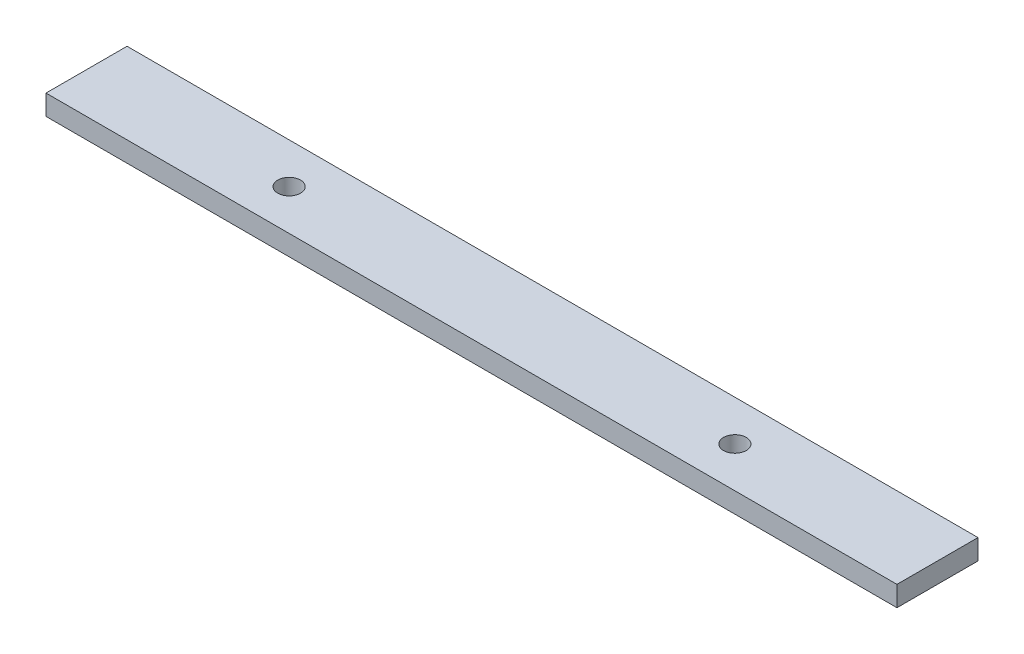
ISO-10303-21;
HEADER;
FILE_DESCRIPTION(('STEP AP214'),'2;1');
FILE_NAME('part.step','',(''),(''),'','','');
FILE_SCHEMA(('AUTOMOTIVE_DESIGN { 1 0 10303 214 1 1 1 1 }'));
ENDSEC;
DATA;
#1=APPLICATION_CONTEXT('core data for automotive mechanical design processes');
#2=APPLICATION_PROTOCOL_DEFINITION('international standard','automotive_design',2000,#1);
#3=PRODUCT_CONTEXT('',#1,'mechanical');
#4=PRODUCT('Part','Part','',(#3));
#5=PRODUCT_RELATED_PRODUCT_CATEGORY('part','',(#4));
#6=PRODUCT_DEFINITION_FORMATION('','',#4);
#7=PRODUCT_DEFINITION_CONTEXT('part definition',#1,'design');
#8=PRODUCT_DEFINITION('design','',#6,#7);
#9=PRODUCT_DEFINITION_SHAPE('','',#8);
#10=(LENGTH_UNIT() NAMED_UNIT(*) SI_UNIT(.MILLI.,.METRE.));
#11=(NAMED_UNIT(*) PLANE_ANGLE_UNIT() SI_UNIT($,.RADIAN.));
#12=(NAMED_UNIT(*) SI_UNIT($,.STERADIAN.) SOLID_ANGLE_UNIT());
#13=UNCERTAINTY_MEASURE_WITH_UNIT(LENGTH_MEASURE(1.E-05),#10,'distance_accuracy_value','');
#14=(GEOMETRIC_REPRESENTATION_CONTEXT(3) GLOBAL_UNCERTAINTY_ASSIGNED_CONTEXT((#13)) GLOBAL_UNIT_ASSIGNED_CONTEXT((#10,
#11,#12)) REPRESENTATION_CONTEXT('',''));
#15=CARTESIAN_POINT('',(0.,0.,0.));
#16=DIRECTION('',(0.,0.,1.));
#17=DIRECTION('',(1.,0.,0.));
#18=AXIS2_PLACEMENT_3D('',#15,#16,#17);
#19=CARTESIAN_POINT('',(133.35,6.35,-12.7));
#20=DIRECTION('',(-1.,0.,0.));
#21=DIRECTION('',(0.,0.,1.));
#22=AXIS2_PLACEMENT_3D('',#19,#20,#21);
#23=PLANE('',#22);
#24=DIRECTION('',(0.,0.,-1.));
#25=VECTOR('',#24,1.);
#26=CARTESIAN_POINT('',(133.35,0.,-12.7));
#27=LINE('',#26,#25);
#28=CARTESIAN_POINT('',(133.35,0.,12.7));
#29=VERTEX_POINT('',#28);
#30=CARTESIAN_POINT('',(133.35,0.,-12.7));
#31=VERTEX_POINT('',#30);
#32=EDGE_CURVE('E102',#29,#31,#27,.T.);
#33=ORIENTED_EDGE('',*,*,#32,.T.);
#34=DIRECTION('',(0.,-1.,0.));
#35=VECTOR('',#34,1.);
#36=CARTESIAN_POINT('',(133.35,6.35,-12.7));
#37=LINE('',#36,#35);
#38=CARTESIAN_POINT('',(133.35,6.35,-12.7));
#39=VERTEX_POINT('',#38);
#40=EDGE_CURVE('E11',#39,#31,#37,.T.);
#41=ORIENTED_EDGE('',*,*,#40,.F.);
#42=DIRECTION('',(0.,0.,-1.));
#43=VECTOR('',#42,1.);
#44=CARTESIAN_POINT('',(133.35,6.35,-12.7));
#45=LINE('',#44,#43);
#46=CARTESIAN_POINT('',(133.35,6.35,12.7));
#47=VERTEX_POINT('',#46);
#48=EDGE_CURVE('E90',#47,#39,#45,.T.);
#49=ORIENTED_EDGE('',*,*,#48,.F.);
#50=DIRECTION('',(0.,-1.,0.));
#51=VECTOR('',#50,1.);
#52=CARTESIAN_POINT('',(133.35,6.35,12.7));
#53=LINE('',#52,#51);
#54=EDGE_CURVE('E98',#47,#29,#53,.T.);
#55=ORIENTED_EDGE('',*,*,#54,.T.);
#56=EDGE_LOOP('',(#33,#41,#49,#55));
#57=FACE_BOUND('',#56,.T.);
#58=ADVANCED_FACE('F39',(#57),#23,.F.);
#59=CARTESIAN_POINT('',(-133.35,6.35,-12.7));
#60=DIRECTION('',(0.,0.,1.));
#61=DIRECTION('',(1.,0.,0.));
#62=AXIS2_PLACEMENT_3D('',#59,#60,#61);
#63=PLANE('',#62);
#64=DIRECTION('',(-1.,0.,0.));
#65=VECTOR('',#64,1.);
#66=CARTESIAN_POINT('',(-133.35,0.,-12.7));
#67=LINE('',#66,#65);
#68=CARTESIAN_POINT('',(-133.35,0.,-12.7));
#69=VERTEX_POINT('',#68);
#70=EDGE_CURVE('E94',#31,#69,#67,.T.);
#71=ORIENTED_EDGE('',*,*,#70,.T.);
#72=DIRECTION('',(0.,-1.,0.));
#73=VECTOR('',#72,1.);
#74=CARTESIAN_POINT('',(-133.35,6.35,-12.7));
#75=LINE('',#74,#73);
#76=CARTESIAN_POINT('',(-133.35,6.35,-12.7));
#77=VERTEX_POINT('',#76);
#78=EDGE_CURVE('E47',#77,#69,#75,.T.);
#79=ORIENTED_EDGE('',*,*,#78,.F.);
#80=DIRECTION('',(-1.,0.,0.));
#81=VECTOR('',#80,1.);
#82=CARTESIAN_POINT('',(-133.35,6.35,-12.7));
#83=LINE('',#82,#81);
#84=EDGE_CURVE('E85',#39,#77,#83,.T.);
#85=ORIENTED_EDGE('',*,*,#84,.F.);
#86=ORIENTED_EDGE('',*,*,#40,.T.);
#87=EDGE_LOOP('',(#71,#79,#85,#86));
#88=FACE_BOUND('',#87,.T.);
#89=ADVANCED_FACE('F93',(#88),#63,.F.);
#90=CARTESIAN_POINT('',(-133.35,6.35,-12.7));
#91=DIRECTION('',(1.,0.,0.));
#92=DIRECTION('',(0.,0.,-1.));
#93=AXIS2_PLACEMENT_3D('',#90,#91,#92);
#94=PLANE('',#93);
#95=DIRECTION('',(0.,0.,1.));
#96=VECTOR('',#95,1.);
#97=CARTESIAN_POINT('',(-133.35,0.,-12.7));
#98=LINE('',#97,#96);
#99=CARTESIAN_POINT('',(-133.35,0.,12.7));
#100=VERTEX_POINT('',#99);
#101=EDGE_CURVE('E72',#69,#100,#98,.T.);
#102=ORIENTED_EDGE('',*,*,#101,.T.);
#103=DIRECTION('',(0.,-1.,0.));
#104=VECTOR('',#103,1.);
#105=CARTESIAN_POINT('',(-133.35,6.35,12.7));
#106=LINE('',#105,#104);
#107=CARTESIAN_POINT('',(-133.35,6.35,12.7));
#108=VERTEX_POINT('',#107);
#109=EDGE_CURVE('E95',#108,#100,#106,.T.);
#110=ORIENTED_EDGE('',*,*,#109,.F.);
#111=DIRECTION('',(0.,0.,1.));
#112=VECTOR('',#111,1.);
#113=CARTESIAN_POINT('',(-133.35,6.35,-12.7));
#114=LINE('',#113,#112);
#115=EDGE_CURVE('E88',#77,#108,#114,.T.);
#116=ORIENTED_EDGE('',*,*,#115,.F.);
#117=ORIENTED_EDGE('',*,*,#78,.T.);
#118=EDGE_LOOP('',(#102,#110,#116,#117));
#119=FACE_BOUND('',#118,.T.);
#120=ADVANCED_FACE('F96',(#119),#94,.F.);
#121=CARTESIAN_POINT('',(-133.35,6.35,12.7));
#122=DIRECTION('',(0.,0.,-1.));
#123=DIRECTION('',(-1.,0.,0.));
#124=AXIS2_PLACEMENT_3D('',#121,#122,#123);
#125=PLANE('',#124);
#126=DIRECTION('',(1.,0.,0.));
#127=VECTOR('',#126,1.);
#128=CARTESIAN_POINT('',(-133.35,0.,12.7));
#129=LINE('',#128,#127);
#130=EDGE_CURVE('E78',#100,#29,#129,.T.);
#131=ORIENTED_EDGE('',*,*,#130,.T.);
#132=ORIENTED_EDGE('',*,*,#54,.F.);
#133=DIRECTION('',(1.,0.,0.));
#134=VECTOR('',#133,1.);
#135=CARTESIAN_POINT('',(-133.35,6.35,12.7));
#136=LINE('',#135,#134);
#137=EDGE_CURVE('E55',#108,#47,#136,.T.);
#138=ORIENTED_EDGE('',*,*,#137,.F.);
#139=ORIENTED_EDGE('',*,*,#109,.T.);
#140=EDGE_LOOP('',(#131,#132,#138,#139));
#141=FACE_BOUND('',#140,.T.);
#142=ADVANCED_FACE('F110',(#141),#125,.F.);
#143=CARTESIAN_POINT('',(0.,6.35,0.));
#144=DIRECTION('',(0.,1.,0.));
#145=DIRECTION('',(0.,0.,1.));
#146=AXIS2_PLACEMENT_3D('',#143,#144,#145);
#147=PLANE('',#146);
#148=CARTESIAN_POINT('',(-69.85,6.35,0.));
#149=DIRECTION('',(0.,1.,0.));
#150=DIRECTION('',(0.,0.,1.));
#151=AXIS2_PLACEMENT_3D('',#148,#149,#150);
#152=CIRCLE('',#151,3.57123999999999);
#153=CARTESIAN_POINT('',(-69.85,6.35,3.57123999999999));
#154=VERTEX_POINT('',#153);
#155=EDGE_CURVE('E124',#154,#154,#152,.T.);
#156=ORIENTED_EDGE('',*,*,#155,.F.);
#157=EDGE_LOOP('',(#156));
#158=FACE_BOUND('',#157,.T.);
#159=CARTESIAN_POINT('',(69.85,6.35,0.));
#160=DIRECTION('',(0.,1.,0.));
#161=DIRECTION('',(0.,0.,1.));
#162=AXIS2_PLACEMENT_3D('',#159,#160,#161);
#163=CIRCLE('',#162,3.57123999999999);
#164=CARTESIAN_POINT('',(69.85,6.35,3.57123999999996));
#165=VERTEX_POINT('',#164);
#166=EDGE_CURVE('E118',#165,#165,#163,.T.);
#167=ORIENTED_EDGE('',*,*,#166,.F.);
#168=EDGE_LOOP('',(#167));
#169=FACE_BOUND('',#168,.T.);
#170=ORIENTED_EDGE('',*,*,#48,.T.);
#171=ORIENTED_EDGE('',*,*,#84,.T.);
#172=ORIENTED_EDGE('',*,*,#115,.T.);
#173=ORIENTED_EDGE('',*,*,#137,.T.);
#174=EDGE_LOOP('',(#170,#171,#172,#173));
#175=FACE_BOUND('',#174,.T.);
#176=ADVANCED_FACE('F86',(#158,#169,#175),#147,.T.);
#177=CARTESIAN_POINT('',(0.,0.,0.));
#178=DIRECTION('',(0.,1.,0.));
#179=DIRECTION('',(0.,0.,1.));
#180=AXIS2_PLACEMENT_3D('',#177,#178,#179);
#181=PLANE('',#180);
#182=CARTESIAN_POINT('',(-69.85,0.,0.));
#183=DIRECTION('',(0.,1.,0.));
#184=DIRECTION('',(0.,0.,1.));
#185=AXIS2_PLACEMENT_3D('',#182,#183,#184);
#186=CIRCLE('',#185,3.57123999999999);
#187=CARTESIAN_POINT('',(-69.85,0.,3.57123999999999));
#188=VERTEX_POINT('',#187);
#189=EDGE_CURVE('E121',#188,#188,#186,.T.);
#190=ORIENTED_EDGE('',*,*,#189,.T.);
#191=EDGE_LOOP('',(#190));
#192=FACE_BOUND('',#191,.T.);
#193=CARTESIAN_POINT('',(69.85,0.,0.));
#194=DIRECTION('',(0.,1.,0.));
#195=DIRECTION('',(0.,0.,1.));
#196=AXIS2_PLACEMENT_3D('',#193,#194,#195);
#197=CIRCLE('',#196,3.57123999999999);
#198=CARTESIAN_POINT('',(69.85,0.,3.57123999999996));
#199=VERTEX_POINT('',#198);
#200=EDGE_CURVE('E105',#199,#199,#197,.T.);
#201=ORIENTED_EDGE('',*,*,#200,.T.);
#202=EDGE_LOOP('',(#201));
#203=FACE_BOUND('',#202,.T.);
#204=ORIENTED_EDGE('',*,*,#32,.F.);
#205=ORIENTED_EDGE('',*,*,#130,.F.);
#206=ORIENTED_EDGE('',*,*,#101,.F.);
#207=ORIENTED_EDGE('',*,*,#70,.F.);
#208=EDGE_LOOP('',(#204,#205,#206,#207));
#209=FACE_BOUND('',#208,.T.);
#210=ADVANCED_FACE('F113',(#192,#203,#209),#181,.F.);
#211=CARTESIAN_POINT('',(69.85,6.35,0.));
#212=DIRECTION('',(0.,1.,0.));
#213=DIRECTION('',(0.,0.,1.));
#214=AXIS2_PLACEMENT_3D('',#211,#212,#213);
#215=CYLINDRICAL_SURFACE('',#214,3.57123999999999);
#216=ORIENTED_EDGE('',*,*,#200,.F.);
#217=EDGE_LOOP('',(#216));
#218=FACE_BOUND('',#217,.T.);
#219=ORIENTED_EDGE('',*,*,#166,.T.);
#220=EDGE_LOOP('',(#219));
#221=FACE_BOUND('',#220,.T.);
#222=ADVANCED_FACE('F135',(#218,#221),#215,.F.);
#223=CARTESIAN_POINT('',(-69.85,6.35,0.));
#224=DIRECTION('',(0.,1.,0.));
#225=DIRECTION('',(0.,0.,1.));
#226=AXIS2_PLACEMENT_3D('',#223,#224,#225);
#227=CYLINDRICAL_SURFACE('',#226,3.57123999999999);
#228=ORIENTED_EDGE('',*,*,#189,.F.);
#229=EDGE_LOOP('',(#228));
#230=FACE_BOUND('',#229,.T.);
#231=ORIENTED_EDGE('',*,*,#155,.T.);
#232=EDGE_LOOP('',(#231));
#233=FACE_BOUND('',#232,.T.);
#234=ADVANCED_FACE('F128',(#230,#233),#227,.F.);
#235=CLOSED_SHELL('',(#58,#89,#120,#142,#176,#210,#222,#234));
#236=MANIFOLD_SOLID_BREP('B2',#235);
#237=ADVANCED_BREP_SHAPE_REPRESENTATION('',(#18,#236),#14);
#238=SHAPE_DEFINITION_REPRESENTATION(#9,#237);
ENDSEC;
END-ISO-10303-21;
